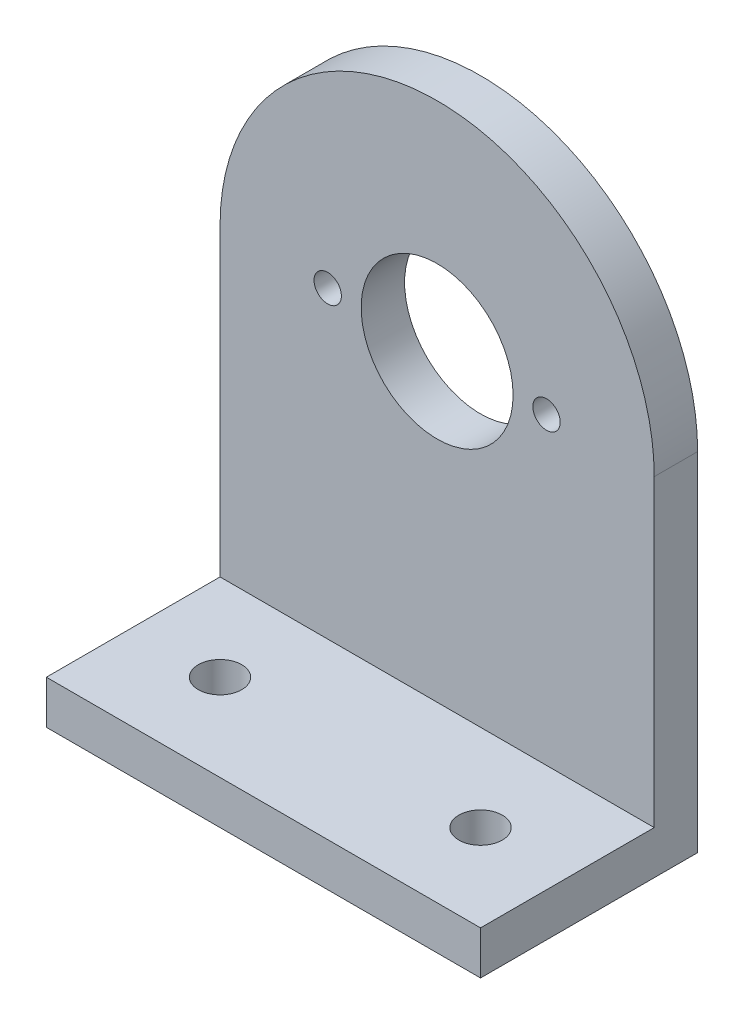
ISO-10303-21;
HEADER;
FILE_DESCRIPTION(('STEP AP214'),'2;1');
FILE_NAME('part.step','',(''),(''),'','','');
FILE_SCHEMA(('AUTOMOTIVE_DESIGN { 1 0 10303 214 1 1 1 1 }'));
ENDSEC;
DATA;
#1=APPLICATION_CONTEXT('core data for automotive mechanical design processes');
#2=APPLICATION_PROTOCOL_DEFINITION('international standard','automotive_design',2000,#1);
#3=PRODUCT_CONTEXT('',#1,'mechanical');
#4=PRODUCT('Part','Part','',(#3));
#5=PRODUCT_RELATED_PRODUCT_CATEGORY('part','',(#4));
#6=PRODUCT_DEFINITION_FORMATION('','',#4);
#7=PRODUCT_DEFINITION_CONTEXT('part definition',#1,'design');
#8=PRODUCT_DEFINITION('design','',#6,#7);
#9=PRODUCT_DEFINITION_SHAPE('','',#8);
#10=(LENGTH_UNIT() NAMED_UNIT(*) SI_UNIT(.MILLI.,.METRE.));
#11=(NAMED_UNIT(*) PLANE_ANGLE_UNIT() SI_UNIT($,.RADIAN.));
#12=(NAMED_UNIT(*) SI_UNIT($,.STERADIAN.) SOLID_ANGLE_UNIT());
#13=UNCERTAINTY_MEASURE_WITH_UNIT(LENGTH_MEASURE(1.E-05),#10,'distance_accuracy_value','');
#14=(GEOMETRIC_REPRESENTATION_CONTEXT(3) GLOBAL_UNCERTAINTY_ASSIGNED_CONTEXT((#13)) GLOBAL_UNIT_ASSIGNED_CONTEXT((#10,
#11,#12)) REPRESENTATION_CONTEXT('',''));
#15=CARTESIAN_POINT('',(0.,0.,0.));
#16=DIRECTION('',(0.,0.,1.));
#17=DIRECTION('',(1.,0.,0.));
#18=AXIS2_PLACEMENT_3D('',#15,#16,#17);
#19=CARTESIAN_POINT('',(0.,0.,3.175));
#20=DIRECTION('',(0.,0.,-1.));
#21=DIRECTION('',(-1.,0.,0.));
#22=AXIS2_PLACEMENT_3D('',#19,#20,#21);
#23=CYLINDRICAL_SURFACE('',#22,15.875);
#24=CARTESIAN_POINT('',(0.,0.,3.175));
#25=DIRECTION('',(0.,0.,1.));
#26=DIRECTION('',(1.,0.,0.));
#27=AXIS2_PLACEMENT_3D('',#24,#25,#26);
#28=CIRCLE('',#27,15.875);
#29=CARTESIAN_POINT('',(15.875,0.,3.175));
#30=VERTEX_POINT('',#29);
#31=CARTESIAN_POINT('',(-15.875,0.,3.175));
#32=VERTEX_POINT('',#31);
#33=EDGE_CURVE('E157',#30,#32,#28,.T.);
#34=ORIENTED_EDGE('',*,*,#33,.F.);
#35=DIRECTION('',(0.,0.,-1.));
#36=VECTOR('',#35,1.);
#37=CARTESIAN_POINT('',(15.875,0.,3.175));
#38=LINE('',#37,#36);
#39=CARTESIAN_POINT('',(15.875,0.,0.));
#40=VERTEX_POINT('',#39);
#41=EDGE_CURVE('E12',#30,#40,#38,.T.);
#42=ORIENTED_EDGE('',*,*,#41,.T.);
#43=CARTESIAN_POINT('',(0.,0.,0.));
#44=DIRECTION('',(0.,0.,1.));
#45=DIRECTION('',(1.,0.,0.));
#46=AXIS2_PLACEMENT_3D('',#43,#44,#45);
#47=CIRCLE('',#46,15.875);
#48=CARTESIAN_POINT('',(-15.875,0.,0.));
#49=VERTEX_POINT('',#48);
#50=EDGE_CURVE('E160',#40,#49,#47,.T.);
#51=ORIENTED_EDGE('',*,*,#50,.T.);
#52=DIRECTION('',(0.,0.,-1.));
#53=VECTOR('',#52,1.);
#54=CARTESIAN_POINT('',(-15.875,0.,3.175));
#55=LINE('',#54,#53);
#56=EDGE_CURVE('E67',#32,#49,#55,.T.);
#57=ORIENTED_EDGE('',*,*,#56,.F.);
#58=EDGE_LOOP('',(#34,#42,#51,#57));
#59=FACE_BOUND('',#58,.T.);
#60=ADVANCED_FACE('F58',(#59),#23,.T.);
#61=CARTESIAN_POINT('',(0.,0.,0.));
#62=DIRECTION('',(0.,0.,1.));
#63=DIRECTION('',(1.,0.,0.));
#64=AXIS2_PLACEMENT_3D('',#61,#62,#63);
#65=PLANE('',#64);
#66=CARTESIAN_POINT('',(-8.001,0.,0.));
#67=DIRECTION('',(0.,0.,1.));
#68=DIRECTION('',(1.,0.,0.));
#69=AXIS2_PLACEMENT_3D('',#66,#67,#68);
#70=CIRCLE('',#69,0.999999999999998);
#71=CARTESIAN_POINT('',(-7.001,0.,0.));
#72=VERTEX_POINT('',#71);
#73=EDGE_CURVE('E237',#72,#72,#70,.T.);
#74=ORIENTED_EDGE('',*,*,#73,.T.);
#75=EDGE_LOOP('',(#74));
#76=FACE_BOUND('',#75,.T.);
#77=CARTESIAN_POINT('',(8.001,0.,0.));
#78=DIRECTION('',(0.,0.,1.));
#79=DIRECTION('',(1.,0.,0.));
#80=AXIS2_PLACEMENT_3D('',#77,#78,#79);
#81=CIRCLE('',#80,0.999999999999998);
#82=CARTESIAN_POINT('',(9.001,0.,0.));
#83=VERTEX_POINT('',#82);
#84=EDGE_CURVE('E241',#83,#83,#81,.T.);
#85=ORIENTED_EDGE('',*,*,#84,.T.);
#86=EDGE_LOOP('',(#85));
#87=FACE_BOUND('',#86,.T.);
#88=CARTESIAN_POINT('',(0.,0.,0.));
#89=DIRECTION('',(0.,0.,1.));
#90=DIRECTION('',(1.,0.,0.));
#91=AXIS2_PLACEMENT_3D('',#88,#89,#90);
#92=CIRCLE('',#91,5.55625);
#93=CARTESIAN_POINT('',(5.55625,0.,0.));
#94=VERTEX_POINT('',#93);
#95=EDGE_CURVE('E151',#94,#94,#92,.T.);
#96=ORIENTED_EDGE('',*,*,#95,.T.);
#97=EDGE_LOOP('',(#96));
#98=FACE_BOUND('',#97,.T.);
#99=ORIENTED_EDGE('',*,*,#50,.F.);
#100=DIRECTION('',(0.,-1.,0.));
#101=VECTOR('',#100,1.);
#102=CARTESIAN_POINT('',(15.875,0.,0.));
#103=LINE('',#102,#101);
#104=CARTESIAN_POINT('',(15.875,-25.4,0.));
#105=VERTEX_POINT('',#104);
#106=EDGE_CURVE('E167',#40,#105,#103,.T.);
#107=ORIENTED_EDGE('',*,*,#106,.T.);
#108=DIRECTION('',(1.,0.,0.));
#109=VECTOR('',#108,1.);
#110=CARTESIAN_POINT('',(-15.875,-25.4,0.));
#111=LINE('',#110,#109);
#112=CARTESIAN_POINT('',(-15.875,-25.4,0.));
#113=VERTEX_POINT('',#112);
#114=EDGE_CURVE('E154',#113,#105,#111,.T.);
#115=ORIENTED_EDGE('',*,*,#114,.F.);
#116=DIRECTION('',(0.,-1.,0.));
#117=VECTOR('',#116,1.);
#118=CARTESIAN_POINT('',(-15.875,0.,0.));
#119=LINE('',#118,#117);
#120=EDGE_CURVE('E99',#49,#113,#119,.T.);
#121=ORIENTED_EDGE('',*,*,#120,.F.);
#122=EDGE_LOOP('',(#99,#107,#115,#121));
#123=FACE_BOUND('',#122,.T.);
#124=ADVANCED_FACE('F172',(#76,#87,#98,#123),#65,.F.);
#125=CARTESIAN_POINT('',(0.,0.,3.175));
#126=DIRECTION('',(0.,0.,1.));
#127=DIRECTION('',(1.,0.,0.));
#128=AXIS2_PLACEMENT_3D('',#125,#126,#127);
#129=PLANE('',#128);
#130=CARTESIAN_POINT('',(-8.001,0.,3.175));
#131=DIRECTION('',(0.,0.,1.));
#132=DIRECTION('',(1.,0.,0.));
#133=AXIS2_PLACEMENT_3D('',#130,#131,#132);
#134=CIRCLE('',#133,0.999999999999998);
#135=CARTESIAN_POINT('',(-7.001,0.,3.175));
#136=VERTEX_POINT('',#135);
#137=EDGE_CURVE('E234',#136,#136,#134,.T.);
#138=ORIENTED_EDGE('',*,*,#137,.F.);
#139=EDGE_LOOP('',(#138));
#140=FACE_BOUND('',#139,.T.);
#141=CARTESIAN_POINT('',(8.001,0.,3.175));
#142=DIRECTION('',(0.,0.,1.));
#143=DIRECTION('',(1.,0.,0.));
#144=AXIS2_PLACEMENT_3D('',#141,#142,#143);
#145=CIRCLE('',#144,0.999999999999999);
#146=CARTESIAN_POINT('',(9.001,0.,3.175));
#147=VERTEX_POINT('',#146);
#148=EDGE_CURVE('E238',#147,#147,#145,.T.);
#149=ORIENTED_EDGE('',*,*,#148,.F.);
#150=EDGE_LOOP('',(#149));
#151=FACE_BOUND('',#150,.T.);
#152=DIRECTION('',(-1.,0.,0.));
#153=VECTOR('',#152,1.);
#154=CARTESIAN_POINT('',(-15.875,-22.225,3.175));
#155=LINE('',#154,#153);
#156=CARTESIAN_POINT('',(15.875,-22.225,3.175));
#157=VERTEX_POINT('',#156);
#158=CARTESIAN_POINT('',(-15.875,-22.225,3.175));
#159=VERTEX_POINT('',#158);
#160=EDGE_CURVE('E75',#157,#159,#155,.T.);
#161=ORIENTED_EDGE('',*,*,#160,.F.);
#162=DIRECTION('',(0.,-1.,0.));
#163=VECTOR('',#162,1.);
#164=CARTESIAN_POINT('',(15.875,0.,3.175));
#165=LINE('',#164,#163);
#166=EDGE_CURVE('E163',#30,#157,#165,.T.);
#167=ORIENTED_EDGE('',*,*,#166,.F.);
#168=ORIENTED_EDGE('',*,*,#33,.T.);
#169=DIRECTION('',(0.,-1.,0.));
#170=VECTOR('',#169,1.);
#171=CARTESIAN_POINT('',(-15.875,0.,3.175));
#172=LINE('',#171,#170);
#173=EDGE_CURVE('E125',#32,#159,#172,.T.);
#174=ORIENTED_EDGE('',*,*,#173,.T.);
#175=EDGE_LOOP('',(#161,#167,#168,#174));
#176=FACE_BOUND('',#175,.T.);
#177=CARTESIAN_POINT('',(0.,0.,3.175));
#178=DIRECTION('',(0.,0.,1.));
#179=DIRECTION('',(1.,0.,0.));
#180=AXIS2_PLACEMENT_3D('',#177,#178,#179);
#181=CIRCLE('',#180,5.55625);
#182=CARTESIAN_POINT('',(5.55625,0.,3.175));
#183=VERTEX_POINT('',#182);
#184=EDGE_CURVE('E150',#183,#183,#181,.T.);
#185=ORIENTED_EDGE('',*,*,#184,.F.);
#186=EDGE_LOOP('',(#185));
#187=FACE_BOUND('',#186,.T.);
#188=ADVANCED_FACE('F178',(#140,#151,#176,#187),#129,.T.);
#189=CARTESIAN_POINT('',(-15.875,0.,3.175));
#190=DIRECTION('',(1.,0.,0.));
#191=DIRECTION('',(0.,1.,0.));
#192=AXIS2_PLACEMENT_3D('',#189,#190,#191);
#193=PLANE('',#192);
#194=ORIENTED_EDGE('',*,*,#120,.T.);
#195=DIRECTION('',(0.,0.,-1.));
#196=VECTOR('',#195,1.);
#197=CARTESIAN_POINT('',(-15.875,-25.4,3.175));
#198=LINE('',#197,#196);
#199=CARTESIAN_POINT('',(-15.875,-25.4,15.875));
#200=VERTEX_POINT('',#199);
#201=EDGE_CURVE('E116',#200,#113,#198,.T.);
#202=ORIENTED_EDGE('',*,*,#201,.F.);
#203=DIRECTION('',(0.,-1.,0.));
#204=VECTOR('',#203,1.);
#205=CARTESIAN_POINT('',(-15.875,-25.4,15.875));
#206=LINE('',#205,#204);
#207=CARTESIAN_POINT('',(-15.875,-22.225,15.875));
#208=VERTEX_POINT('',#207);
#209=EDGE_CURVE('E121',#208,#200,#206,.T.);
#210=ORIENTED_EDGE('',*,*,#209,.F.);
#211=DIRECTION('',(0.,0.,-1.));
#212=VECTOR('',#211,1.);
#213=CARTESIAN_POINT('',(-15.875,-22.225,15.875));
#214=LINE('',#213,#212);
#215=EDGE_CURVE('E144',#208,#159,#214,.T.);
#216=ORIENTED_EDGE('',*,*,#215,.T.);
#217=ORIENTED_EDGE('',*,*,#173,.F.);
#218=ORIENTED_EDGE('',*,*,#56,.T.);
#219=EDGE_LOOP('',(#194,#202,#210,#216,#217,#218));
#220=FACE_BOUND('',#219,.T.);
#221=ADVANCED_FACE('F118',(#220),#193,.F.);
#222=CARTESIAN_POINT('',(-15.875,-25.4,3.175));
#223=DIRECTION('',(0.,1.,0.));
#224=DIRECTION('',(0.,0.,1.));
#225=AXIS2_PLACEMENT_3D('',#222,#223,#224);
#226=PLANE('',#225);
#227=CARTESIAN_POINT('',(-9.525,-25.4,9.525));
#228=DIRECTION('',(0.,1.,0.));
#229=DIRECTION('',(0.,0.,1.));
#230=AXIS2_PLACEMENT_3D('',#227,#228,#229);
#231=CIRCLE('',#230,1.5875);
#232=CARTESIAN_POINT('',(-9.525,-25.4,11.1125));
#233=VERTEX_POINT('',#232);
#234=EDGE_CURVE('E137',#233,#233,#231,.T.);
#235=ORIENTED_EDGE('',*,*,#234,.T.);
#236=EDGE_LOOP('',(#235));
#237=FACE_BOUND('',#236,.T.);
#238=CARTESIAN_POINT('',(9.52500000000001,-25.4,9.52500000000001));
#239=DIRECTION('',(0.,1.,0.));
#240=DIRECTION('',(0.,0.,-1.));
#241=AXIS2_PLACEMENT_3D('',#238,#239,#240);
#242=CIRCLE('',#241,1.5875);
#243=CARTESIAN_POINT('',(9.52500000000001,-25.4,7.93750000000001));
#244=VERTEX_POINT('',#243);
#245=EDGE_CURVE('E140',#244,#244,#242,.T.);
#246=ORIENTED_EDGE('',*,*,#245,.T.);
#247=EDGE_LOOP('',(#246));
#248=FACE_BOUND('',#247,.T.);
#249=ORIENTED_EDGE('',*,*,#114,.T.);
#250=DIRECTION('',(0.,0.,-1.));
#251=VECTOR('',#250,1.);
#252=CARTESIAN_POINT('',(15.875,-25.4,3.175));
#253=LINE('',#252,#251);
#254=CARTESIAN_POINT('',(15.875,-25.4,15.875));
#255=VERTEX_POINT('',#254);
#256=EDGE_CURVE('E62',#255,#105,#253,.T.);
#257=ORIENTED_EDGE('',*,*,#256,.F.);
#258=DIRECTION('',(1.,0.,0.));
#259=VECTOR('',#258,1.);
#260=CARTESIAN_POINT('',(-15.875,-25.4,15.875));
#261=LINE('',#260,#259);
#262=EDGE_CURVE('E127',#200,#255,#261,.T.);
#263=ORIENTED_EDGE('',*,*,#262,.F.);
#264=ORIENTED_EDGE('',*,*,#201,.T.);
#265=EDGE_LOOP('',(#249,#257,#263,#264));
#266=FACE_BOUND('',#265,.T.);
#267=ADVANCED_FACE('F60',(#237,#248,#266),#226,.F.);
#268=CARTESIAN_POINT('',(15.875,0.,3.175));
#269=DIRECTION('',(1.,0.,0.));
#270=DIRECTION('',(0.,1.,0.));
#271=AXIS2_PLACEMENT_3D('',#268,#269,#270);
#272=PLANE('',#271);
#273=ORIENTED_EDGE('',*,*,#106,.F.);
#274=ORIENTED_EDGE('',*,*,#41,.F.);
#275=ORIENTED_EDGE('',*,*,#166,.T.);
#276=DIRECTION('',(0.,0.,-1.));
#277=VECTOR('',#276,1.);
#278=CARTESIAN_POINT('',(15.875,-22.225,15.875));
#279=LINE('',#278,#277);
#280=CARTESIAN_POINT('',(15.875,-22.225,15.875));
#281=VERTEX_POINT('',#280);
#282=EDGE_CURVE('E147',#281,#157,#279,.T.);
#283=ORIENTED_EDGE('',*,*,#282,.F.);
#284=DIRECTION('',(0.,1.,0.));
#285=VECTOR('',#284,1.);
#286=CARTESIAN_POINT('',(15.875,-25.4,15.875));
#287=LINE('',#286,#285);
#288=EDGE_CURVE('E130',#255,#281,#287,.T.);
#289=ORIENTED_EDGE('',*,*,#288,.F.);
#290=ORIENTED_EDGE('',*,*,#256,.T.);
#291=EDGE_LOOP('',(#273,#274,#275,#283,#289,#290));
#292=FACE_BOUND('',#291,.T.);
#293=ADVANCED_FACE('F174',(#292),#272,.T.);
#294=CARTESIAN_POINT('',(0.,0.,0.));
#295=DIRECTION('',(0.,0.,1.));
#296=DIRECTION('',(1.,0.,0.));
#297=AXIS2_PLACEMENT_3D('',#294,#295,#296);
#298=CYLINDRICAL_SURFACE('',#297,5.55625);
#299=ORIENTED_EDGE('',*,*,#95,.F.);
#300=EDGE_LOOP('',(#299));
#301=FACE_BOUND('',#300,.T.);
#302=ORIENTED_EDGE('',*,*,#184,.T.);
#303=EDGE_LOOP('',(#302));
#304=FACE_BOUND('',#303,.T.);
#305=ADVANCED_FACE('F191',(#301,#304),#298,.F.);
#306=CARTESIAN_POINT('',(-15.875,-22.225,15.875));
#307=DIRECTION('',(0.,-1.,0.));
#308=DIRECTION('',(0.,0.,-1.));
#309=AXIS2_PLACEMENT_3D('',#306,#307,#308);
#310=PLANE('',#309);
#311=CARTESIAN_POINT('',(-9.525,-22.225,9.525));
#312=DIRECTION('',(0.,1.,0.));
#313=DIRECTION('',(0.,0.,1.));
#314=AXIS2_PLACEMENT_3D('',#311,#312,#313);
#315=CIRCLE('',#314,1.5875);
#316=CARTESIAN_POINT('',(-9.525,-22.225,11.1125));
#317=VERTEX_POINT('',#316);
#318=EDGE_CURVE('E248',#317,#317,#315,.T.);
#319=ORIENTED_EDGE('',*,*,#318,.F.);
#320=EDGE_LOOP('',(#319));
#321=FACE_BOUND('',#320,.T.);
#322=CARTESIAN_POINT('',(9.52500000000001,-22.225,9.52500000000001));
#323=DIRECTION('',(0.,1.,0.));
#324=DIRECTION('',(0.,0.,-1.));
#325=AXIS2_PLACEMENT_3D('',#322,#323,#324);
#326=CIRCLE('',#325,1.5875);
#327=CARTESIAN_POINT('',(9.52500000000001,-22.225,7.93750000000001));
#328=VERTEX_POINT('',#327);
#329=EDGE_CURVE('E250',#328,#328,#326,.T.);
#330=ORIENTED_EDGE('',*,*,#329,.F.);
#331=EDGE_LOOP('',(#330));
#332=FACE_BOUND('',#331,.T.);
#333=ORIENTED_EDGE('',*,*,#160,.T.);
#334=ORIENTED_EDGE('',*,*,#215,.F.);
#335=DIRECTION('',(-1.,0.,0.));
#336=VECTOR('',#335,1.);
#337=CARTESIAN_POINT('',(-15.875,-22.225,15.875));
#338=LINE('',#337,#336);
#339=EDGE_CURVE('E134',#281,#208,#338,.T.);
#340=ORIENTED_EDGE('',*,*,#339,.F.);
#341=ORIENTED_EDGE('',*,*,#282,.T.);
#342=EDGE_LOOP('',(#333,#334,#340,#341));
#343=FACE_BOUND('',#342,.T.);
#344=ADVANCED_FACE('F177',(#321,#332,#343),#310,.F.);
#345=CARTESIAN_POINT('',(0.,0.,15.875));
#346=DIRECTION('',(0.,0.,-1.));
#347=DIRECTION('',(-1.,0.,0.));
#348=AXIS2_PLACEMENT_3D('',#345,#346,#347);
#349=PLANE('',#348);
#350=ORIENTED_EDGE('',*,*,#209,.T.);
#351=ORIENTED_EDGE('',*,*,#262,.T.);
#352=ORIENTED_EDGE('',*,*,#288,.T.);
#353=ORIENTED_EDGE('',*,*,#339,.T.);
#354=EDGE_LOOP('',(#350,#351,#352,#353));
#355=FACE_BOUND('',#354,.T.);
#356=ADVANCED_FACE('F132',(#355),#349,.F.);
#357=CARTESIAN_POINT('',(9.52500000000001,-25.4,9.52500000000001));
#358=DIRECTION('',(0.,1.,0.));
#359=DIRECTION('',(0.,0.,1.));
#360=AXIS2_PLACEMENT_3D('',#357,#358,#359);
#361=CYLINDRICAL_SURFACE('',#360,1.5875);
#362=ORIENTED_EDGE('',*,*,#245,.F.);
#363=EDGE_LOOP('',(#362));
#364=FACE_BOUND('',#363,.T.);
#365=ORIENTED_EDGE('',*,*,#329,.T.);
#366=EDGE_LOOP('',(#365));
#367=FACE_BOUND('',#366,.T.);
#368=ADVANCED_FACE('F216',(#364,#367),#361,.F.);
#369=CARTESIAN_POINT('',(-9.525,-25.4,9.525));
#370=DIRECTION('',(0.,1.,0.));
#371=DIRECTION('',(0.,0.,1.));
#372=AXIS2_PLACEMENT_3D('',#369,#370,#371);
#373=CYLINDRICAL_SURFACE('',#372,1.5875);
#374=ORIENTED_EDGE('',*,*,#234,.F.);
#375=EDGE_LOOP('',(#374));
#376=FACE_BOUND('',#375,.T.);
#377=ORIENTED_EDGE('',*,*,#318,.T.);
#378=EDGE_LOOP('',(#377));
#379=FACE_BOUND('',#378,.T.);
#380=ADVANCED_FACE('F219',(#376,#379),#373,.F.);
#381=CARTESIAN_POINT('',(8.001,0.,3.175));
#382=DIRECTION('',(0.,0.,1.));
#383=DIRECTION('',(1.,0.,0.));
#384=AXIS2_PLACEMENT_3D('',#381,#382,#383);
#385=CYLINDRICAL_SURFACE('',#384,0.999999999999998);
#386=ORIENTED_EDGE('',*,*,#148,.T.);
#387=EDGE_LOOP('',(#386));
#388=FACE_BOUND('',#387,.T.);
#389=ORIENTED_EDGE('',*,*,#84,.F.);
#390=EDGE_LOOP('',(#389));
#391=FACE_BOUND('',#390,.T.);
#392=ADVANCED_FACE('F223',(#388,#391),#385,.F.);
#393=CARTESIAN_POINT('',(-8.001,0.,3.175));
#394=DIRECTION('',(0.,0.,1.));
#395=DIRECTION('',(1.,0.,0.));
#396=AXIS2_PLACEMENT_3D('',#393,#394,#395);
#397=CYLINDRICAL_SURFACE('',#396,0.999999999999998);
#398=ORIENTED_EDGE('',*,*,#137,.T.);
#399=EDGE_LOOP('',(#398));
#400=FACE_BOUND('',#399,.T.);
#401=ORIENTED_EDGE('',*,*,#73,.F.);
#402=EDGE_LOOP('',(#401));
#403=FACE_BOUND('',#402,.T.);
#404=ADVANCED_FACE('F226',(#400,#403),#397,.F.);
#405=CLOSED_SHELL('',(#60,#124,#188,#221,#267,#293,#305,#344,#356,#368,#380,#392,#404));
#406=MANIFOLD_SOLID_BREP('B2',#405);
#407=ADVANCED_BREP_SHAPE_REPRESENTATION('',(#18,#406),#14);
#408=SHAPE_DEFINITION_REPRESENTATION(#9,#407);
ENDSEC;
END-ISO-10303-21;
